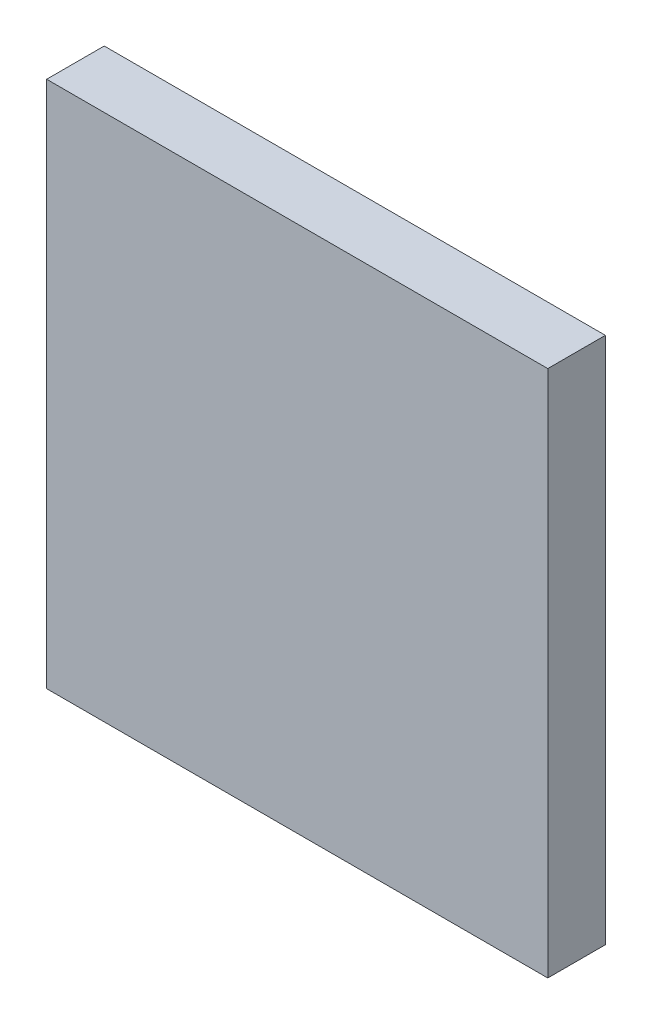
ISO-10303-21;
HEADER;
FILE_DESCRIPTION(('STEP AP214'),'2;1');
FILE_NAME('part.step','',(''),(''),'','','');
FILE_SCHEMA(('AUTOMOTIVE_DESIGN { 1 0 10303 214 1 1 1 1 }'));
ENDSEC;
DATA;
#1=APPLICATION_CONTEXT('core data for automotive mechanical design processes');
#2=APPLICATION_PROTOCOL_DEFINITION('international standard','automotive_design',2000,#1);
#3=PRODUCT_CONTEXT('',#1,'mechanical');
#4=PRODUCT('Part','Part','',(#3));
#5=PRODUCT_RELATED_PRODUCT_CATEGORY('part','',(#4));
#6=PRODUCT_DEFINITION_FORMATION('','',#4);
#7=PRODUCT_DEFINITION_CONTEXT('part definition',#1,'design');
#8=PRODUCT_DEFINITION('design','',#6,#7);
#9=PRODUCT_DEFINITION_SHAPE('','',#8);
#10=(LENGTH_UNIT() NAMED_UNIT(*) SI_UNIT(.MILLI.,.METRE.));
#11=(NAMED_UNIT(*) PLANE_ANGLE_UNIT() SI_UNIT($,.RADIAN.));
#12=(NAMED_UNIT(*) SI_UNIT($,.STERADIAN.) SOLID_ANGLE_UNIT());
#13=UNCERTAINTY_MEASURE_WITH_UNIT(LENGTH_MEASURE(1.E-05),#10,'distance_accuracy_value','');
#14=(GEOMETRIC_REPRESENTATION_CONTEXT(3) GLOBAL_UNCERTAINTY_ASSIGNED_CONTEXT((#13)) GLOBAL_UNIT_ASSIGNED_CONTEXT((#10,
#11,#12)) REPRESENTATION_CONTEXT('',''));
#15=CARTESIAN_POINT('',(0.,0.,0.));
#16=DIRECTION('',(0.,0.,1.));
#17=DIRECTION('',(1.,0.,0.));
#18=AXIS2_PLACEMENT_3D('',#15,#16,#17);
#19=CARTESIAN_POINT('',(-4.7,-4.95,1.2));
#20=DIRECTION('',(0.,0.,1.));
#21=DIRECTION('',(1.,0.,0.));
#22=AXIS2_PLACEMENT_3D('',#19,#20,#21);
#23=PLANE('',#22);
#24=DIRECTION('',(0.,1.,0.));
#25=VECTOR('',#24,1.);
#26=CARTESIAN_POINT('',(4.7,-4.95,1.2));
#27=LINE('',#26,#25);
#28=CARTESIAN_POINT('',(4.7,4.95,1.2));
#29=VERTEX_POINT('',#28);
#30=CARTESIAN_POINT('',(4.7,-4.95,1.2));
#31=VERTEX_POINT('',#30);
#32=EDGE_CURVE('E76',#29,#31,#27,.F.);
#33=ORIENTED_EDGE('',*,*,#32,.F.);
#34=DIRECTION('',(1.,0.,0.));
#35=VECTOR('',#34,1.);
#36=CARTESIAN_POINT('',(-4.7,4.95,1.2));
#37=LINE('',#36,#35);
#38=CARTESIAN_POINT('',(-4.7,4.95,1.2));
#39=VERTEX_POINT('',#38);
#40=EDGE_CURVE('E58',#39,#29,#37,.T.);
#41=ORIENTED_EDGE('',*,*,#40,.F.);
#42=DIRECTION('',(0.,1.,0.));
#43=VECTOR('',#42,1.);
#44=CARTESIAN_POINT('',(-4.7,-4.95,1.2));
#45=LINE('',#44,#43);
#46=CARTESIAN_POINT('',(-4.7,-4.95,1.2));
#47=VERTEX_POINT('',#46);
#48=EDGE_CURVE('E20',#39,#47,#45,.F.);
#49=ORIENTED_EDGE('',*,*,#48,.T.);
#50=DIRECTION('',(1.,0.,0.));
#51=VECTOR('',#50,1.);
#52=CARTESIAN_POINT('',(-4.7,-4.95,1.2));
#53=LINE('',#52,#51);
#54=EDGE_CURVE('E55',#47,#31,#53,.T.);
#55=ORIENTED_EDGE('',*,*,#54,.T.);
#56=EDGE_LOOP('',(#33,#41,#49,#55));
#57=FACE_BOUND('',#56,.T.);
#58=ADVANCED_FACE('F17',(#57),#23,.T.);
#59=CARTESIAN_POINT('',(-4.7,-4.95,0.12));
#60=DIRECTION('',(1.,0.,0.));
#61=DIRECTION('',(0.,0.,-1.));
#62=AXIS2_PLACEMENT_3D('',#59,#60,#61);
#63=PLANE('',#62);
#64=DIRECTION('',(0.,0.,1.));
#65=VECTOR('',#64,1.);
#66=CARTESIAN_POINT('',(-4.7,4.95,0.12));
#67=LINE('',#66,#65);
#68=CARTESIAN_POINT('',(-4.7,4.95,0.12));
#69=VERTEX_POINT('',#68);
#70=EDGE_CURVE('E78',#69,#39,#67,.T.);
#71=ORIENTED_EDGE('',*,*,#70,.F.);
#72=DIRECTION('',(0.,1.,0.));
#73=VECTOR('',#72,1.);
#74=CARTESIAN_POINT('',(-4.7,-4.95,0.12));
#75=LINE('',#74,#73);
#76=CARTESIAN_POINT('',(-4.7,-4.95,0.12));
#77=VERTEX_POINT('',#76);
#78=EDGE_CURVE('E73',#69,#77,#75,.F.);
#79=ORIENTED_EDGE('',*,*,#78,.T.);
#80=DIRECTION('',(0.,0.,1.));
#81=VECTOR('',#80,1.);
#82=CARTESIAN_POINT('',(-4.7,-4.95,0.12));
#83=LINE('',#82,#81);
#84=EDGE_CURVE('E63',#77,#47,#83,.T.);
#85=ORIENTED_EDGE('',*,*,#84,.T.);
#86=ORIENTED_EDGE('',*,*,#48,.F.);
#87=EDGE_LOOP('',(#71,#79,#85,#86));
#88=FACE_BOUND('',#87,.T.);
#89=ADVANCED_FACE('F72',(#88),#63,.F.);
#90=CARTESIAN_POINT('',(-4.7,-4.95,0.12));
#91=DIRECTION('',(0.,1.,0.));
#92=DIRECTION('',(0.,0.,1.));
#93=AXIS2_PLACEMENT_3D('',#90,#91,#92);
#94=PLANE('',#93);
#95=ORIENTED_EDGE('',*,*,#54,.F.);
#96=ORIENTED_EDGE('',*,*,#84,.F.);
#97=DIRECTION('',(1.,0.,0.));
#98=VECTOR('',#97,1.);
#99=CARTESIAN_POINT('',(-4.7,-4.95,0.12));
#100=LINE('',#99,#98);
#101=CARTESIAN_POINT('',(4.7,-4.95,0.12));
#102=VERTEX_POINT('',#101);
#103=EDGE_CURVE('E83',#77,#102,#100,.T.);
#104=ORIENTED_EDGE('',*,*,#103,.T.);
#105=DIRECTION('',(0.,0.,-1.));
#106=VECTOR('',#105,1.);
#107=CARTESIAN_POINT('',(4.7,-4.95,0.12));
#108=LINE('',#107,#106);
#109=EDGE_CURVE('E69',#31,#102,#108,.T.);
#110=ORIENTED_EDGE('',*,*,#109,.F.);
#111=EDGE_LOOP('',(#95,#96,#104,#110));
#112=FACE_BOUND('',#111,.T.);
#113=ADVANCED_FACE('F66',(#112),#94,.F.);
#114=CARTESIAN_POINT('',(4.7,-4.95,0.12));
#115=DIRECTION('',(1.,0.,0.));
#116=DIRECTION('',(0.,0.,-1.));
#117=AXIS2_PLACEMENT_3D('',#114,#115,#116);
#118=PLANE('',#117);
#119=DIRECTION('',(0.,0.,1.));
#120=VECTOR('',#119,1.);
#121=CARTESIAN_POINT('',(4.7,4.95,0.12));
#122=LINE('',#121,#120);
#123=CARTESIAN_POINT('',(4.7,4.95,0.12));
#124=VERTEX_POINT('',#123);
#125=EDGE_CURVE('E34',#29,#124,#122,.F.);
#126=ORIENTED_EDGE('',*,*,#125,.F.);
#127=ORIENTED_EDGE('',*,*,#32,.T.);
#128=ORIENTED_EDGE('',*,*,#109,.T.);
#129=DIRECTION('',(0.,1.,0.));
#130=VECTOR('',#129,1.);
#131=CARTESIAN_POINT('',(4.7,-4.95,0.12));
#132=LINE('',#131,#130);
#133=EDGE_CURVE('E26',#102,#124,#132,.T.);
#134=ORIENTED_EDGE('',*,*,#133,.T.);
#135=EDGE_LOOP('',(#126,#127,#128,#134));
#136=FACE_BOUND('',#135,.T.);
#137=ADVANCED_FACE('F88',(#136),#118,.T.);
#138=CARTESIAN_POINT('',(-4.7,4.95,0.12));
#139=DIRECTION('',(0.,1.,0.));
#140=DIRECTION('',(0.,0.,1.));
#141=AXIS2_PLACEMENT_3D('',#138,#139,#140);
#142=PLANE('',#141);
#143=ORIENTED_EDGE('',*,*,#40,.T.);
#144=ORIENTED_EDGE('',*,*,#125,.T.);
#145=DIRECTION('',(1.,0.,0.));
#146=VECTOR('',#145,1.);
#147=CARTESIAN_POINT('',(-4.7,4.95,0.12));
#148=LINE('',#147,#146);
#149=EDGE_CURVE('E11',#124,#69,#148,.F.);
#150=ORIENTED_EDGE('',*,*,#149,.T.);
#151=ORIENTED_EDGE('',*,*,#70,.T.);
#152=EDGE_LOOP('',(#143,#144,#150,#151));
#153=FACE_BOUND('',#152,.T.);
#154=ADVANCED_FACE('F91',(#153),#142,.T.);
#155=CARTESIAN_POINT('',(-4.7,-4.95,0.12));
#156=DIRECTION('',(0.,0.,1.));
#157=DIRECTION('',(1.,0.,0.));
#158=AXIS2_PLACEMENT_3D('',#155,#156,#157);
#159=PLANE('',#158);
#160=ORIENTED_EDGE('',*,*,#133,.F.);
#161=ORIENTED_EDGE('',*,*,#103,.F.);
#162=ORIENTED_EDGE('',*,*,#78,.F.);
#163=ORIENTED_EDGE('',*,*,#149,.F.);
#164=EDGE_LOOP('',(#160,#161,#162,#163));
#165=FACE_BOUND('',#164,.T.);
#166=ADVANCED_FACE('F90',(#165),#159,.F.);
#167=CLOSED_SHELL('',(#58,#89,#113,#137,#154,#166));
#168=MANIFOLD_SOLID_BREP('B1',#167);
#169=ADVANCED_BREP_SHAPE_REPRESENTATION('',(#18,#168),#14);
#170=SHAPE_DEFINITION_REPRESENTATION(#9,#169);
ENDSEC;
END-ISO-10303-21;
